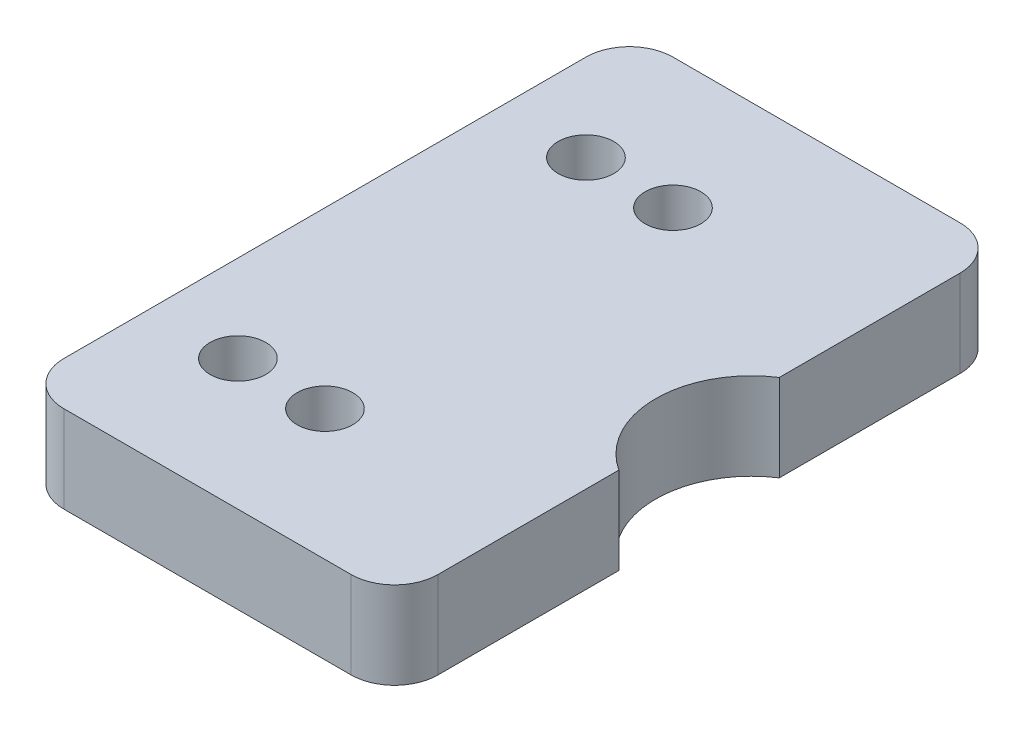
ISO-10303-21;
HEADER;
FILE_DESCRIPTION(('STEP AP214'),'2;1');
FILE_NAME('part.step','',(''),(''),'','','');
FILE_SCHEMA(('AUTOMOTIVE_DESIGN { 1 0 10303 214 1 1 1 1 }'));
ENDSEC;
DATA;
#1=APPLICATION_CONTEXT('core data for automotive mechanical design processes');
#2=APPLICATION_PROTOCOL_DEFINITION('international standard','automotive_design',2000,#1);
#3=PRODUCT_CONTEXT('',#1,'mechanical');
#4=PRODUCT('Part','Part','',(#3));
#5=PRODUCT_RELATED_PRODUCT_CATEGORY('part','',(#4));
#6=PRODUCT_DEFINITION_FORMATION('','',#4);
#7=PRODUCT_DEFINITION_CONTEXT('part definition',#1,'design');
#8=PRODUCT_DEFINITION('design','',#6,#7);
#9=PRODUCT_DEFINITION_SHAPE('','',#8);
#10=(LENGTH_UNIT() NAMED_UNIT(*) SI_UNIT(.MILLI.,.METRE.));
#11=(NAMED_UNIT(*) PLANE_ANGLE_UNIT() SI_UNIT($,.RADIAN.));
#12=(NAMED_UNIT(*) SI_UNIT($,.STERADIAN.) SOLID_ANGLE_UNIT());
#13=UNCERTAINTY_MEASURE_WITH_UNIT(LENGTH_MEASURE(1.E-05),#10,'distance_accuracy_value','');
#14=(GEOMETRIC_REPRESENTATION_CONTEXT(3) GLOBAL_UNCERTAINTY_ASSIGNED_CONTEXT((#13)) GLOBAL_UNIT_ASSIGNED_CONTEXT((#10,
#11,#12)) REPRESENTATION_CONTEXT('',''));
#15=CARTESIAN_POINT('',(0.,0.,0.));
#16=DIRECTION('',(0.,0.,1.));
#17=DIRECTION('',(1.,0.,0.));
#18=AXIS2_PLACEMENT_3D('',#15,#16,#17);
#19=CARTESIAN_POINT('',(62.23,12.7,-44.45));
#20=DIRECTION('',(0.,1.,0.));
#21=DIRECTION('',(0.,0.,1.));
#22=AXIS2_PLACEMENT_3D('',#19,#20,#21);
#23=PLANE('',#22);
#24=CARTESIAN_POINT('',(25.4,12.7,-19.05));
#25=DIRECTION('',(0.,1.,0.));
#26=DIRECTION('',(0.,0.,-1.));
#27=AXIS2_PLACEMENT_3D('',#24,#25,#26);
#28=CIRCLE('',#27,4.06399999999999);
#29=CARTESIAN_POINT('',(25.4,12.7,-23.114));
#30=VERTEX_POINT('',#29);
#31=EDGE_CURVE('E254',#30,#30,#28,.T.);
#32=ORIENTED_EDGE('',*,*,#31,.F.);
#33=EDGE_LOOP('',(#32));
#34=FACE_BOUND('',#33,.T.);
#35=CARTESIAN_POINT('',(25.4,12.7,-69.85));
#36=DIRECTION('',(0.,1.,0.));
#37=DIRECTION('',(0.,0.,1.));
#38=AXIS2_PLACEMENT_3D('',#35,#36,#37);
#39=CIRCLE('',#38,4.06399999999999);
#40=CARTESIAN_POINT('',(25.4,12.7,-65.786));
#41=VERTEX_POINT('',#40);
#42=EDGE_CURVE('E163',#41,#41,#39,.T.);
#43=ORIENTED_EDGE('',*,*,#42,.F.);
#44=EDGE_LOOP('',(#43));
#45=FACE_BOUND('',#44,.T.);
#46=DIRECTION('',(-1.,0.,0.));
#47=VECTOR('',#46,1.);
#48=CARTESIAN_POINT('',(0.,12.7,-88.9));
#49=LINE('',#48,#47);
#50=CARTESIAN_POINT('',(48.26,12.7,-88.9));
#51=VERTEX_POINT('',#50);
#52=CARTESIAN_POINT('',(6.35,12.7,-88.9));
#53=VERTEX_POINT('',#52);
#54=EDGE_CURVE('E152',#51,#53,#49,.T.);
#55=ORIENTED_EDGE('',*,*,#54,.T.);
#56=CARTESIAN_POINT('',(6.35,12.7,-82.55));
#57=DIRECTION('',(0.,1.,0.));
#58=DIRECTION('',(0.,0.,1.));
#59=AXIS2_PLACEMENT_3D('',#56,#57,#58);
#60=CIRCLE('',#59,6.35);
#61=CARTESIAN_POINT('',(0.,12.7,-82.55));
#62=VERTEX_POINT('',#61);
#63=EDGE_CURVE('E215',#53,#62,#60,.T.);
#64=ORIENTED_EDGE('',*,*,#63,.T.);
#65=DIRECTION('',(0.,0.,1.));
#66=VECTOR('',#65,1.);
#67=CARTESIAN_POINT('',(0.,12.7,0.));
#68=LINE('',#67,#66);
#69=CARTESIAN_POINT('',(0.,12.7,-6.35));
#70=VERTEX_POINT('',#69);
#71=EDGE_CURVE('E179',#62,#70,#68,.T.);
#72=ORIENTED_EDGE('',*,*,#71,.T.);
#73=CARTESIAN_POINT('',(6.35,12.7,-6.35));
#74=DIRECTION('',(0.,1.,0.));
#75=DIRECTION('',(0.,0.,1.));
#76=AXIS2_PLACEMENT_3D('',#73,#74,#75);
#77=CIRCLE('',#76,6.35);
#78=CARTESIAN_POINT('',(6.35,12.7,0.));
#79=VERTEX_POINT('',#78);
#80=EDGE_CURVE('E209',#70,#79,#77,.T.);
#81=ORIENTED_EDGE('',*,*,#80,.T.);
#82=DIRECTION('',(1.,0.,0.));
#83=VECTOR('',#82,1.);
#84=CARTESIAN_POINT('',(0.,12.7,0.));
#85=LINE('',#84,#83);
#86=CARTESIAN_POINT('',(48.26,12.7,0.));
#87=VERTEX_POINT('',#86);
#88=EDGE_CURVE('E133',#79,#87,#85,.T.);
#89=ORIENTED_EDGE('',*,*,#88,.T.);
#90=CARTESIAN_POINT('',(48.26,12.7,-6.35));
#91=DIRECTION('',(0.,1.,0.));
#92=DIRECTION('',(0.,0.,1.));
#93=AXIS2_PLACEMENT_3D('',#90,#91,#92);
#94=CIRCLE('',#93,6.35);
#95=CARTESIAN_POINT('',(54.61,12.7,-6.35));
#96=VERTEX_POINT('',#95);
#97=EDGE_CURVE('E69',#87,#96,#94,.T.);
#98=ORIENTED_EDGE('',*,*,#97,.T.);
#99=DIRECTION('',(0.,0.,-1.));
#100=VECTOR('',#99,1.);
#101=CARTESIAN_POINT('',(54.61,12.7,-32.741178539238));
#102=LINE('',#101,#100);
#103=CARTESIAN_POINT('',(54.61,12.7,-32.741178539238));
#104=VERTEX_POINT('',#103);
#105=EDGE_CURVE('E123',#96,#104,#102,.T.);
#106=ORIENTED_EDGE('',*,*,#105,.T.);
#107=CARTESIAN_POINT('',(62.23,12.7,-44.45));
#108=DIRECTION('',(0.,-1.,0.));
#109=DIRECTION('',(0.,0.,1.));
#110=AXIS2_PLACEMENT_3D('',#107,#108,#109);
#111=CIRCLE('',#110,13.97);
#112=CARTESIAN_POINT('',(54.61,12.7,-56.158821460762));
#113=VERTEX_POINT('',#112);
#114=EDGE_CURVE('E128',#104,#113,#111,.T.);
#115=ORIENTED_EDGE('',*,*,#114,.T.);
#116=DIRECTION('',(0.,0.,-1.));
#117=VECTOR('',#116,1.);
#118=CARTESIAN_POINT('',(54.61,12.7,-56.158821460762));
#119=LINE('',#118,#117);
#120=CARTESIAN_POINT('',(54.61,12.7,-82.55));
#121=VERTEX_POINT('',#120);
#122=EDGE_CURVE('E149',#113,#121,#119,.T.);
#123=ORIENTED_EDGE('',*,*,#122,.T.);
#124=CARTESIAN_POINT('',(48.26,12.7,-82.55));
#125=DIRECTION('',(0.,1.,0.));
#126=DIRECTION('',(0.,0.,1.));
#127=AXIS2_PLACEMENT_3D('',#124,#125,#126);
#128=CIRCLE('',#127,6.35);
#129=EDGE_CURVE('E212',#121,#51,#128,.T.);
#130=ORIENTED_EDGE('',*,*,#129,.T.);
#131=EDGE_LOOP('',(#55,#64,#72,#81,#89,#98,#106,#115,#123,#130));
#132=FACE_BOUND('',#131,.T.);
#133=CARTESIAN_POINT('',(12.7,12.7,-69.85));
#134=DIRECTION('',(0.,1.,0.));
#135=DIRECTION('',(0.,0.,1.));
#136=AXIS2_PLACEMENT_3D('',#133,#134,#135);
#137=CIRCLE('',#136,4.06399999999999);
#138=CARTESIAN_POINT('',(12.7,12.7,-65.786));
#139=VERTEX_POINT('',#138);
#140=EDGE_CURVE('E246',#139,#139,#137,.T.);
#141=ORIENTED_EDGE('',*,*,#140,.F.);
#142=EDGE_LOOP('',(#141));
#143=FACE_BOUND('',#142,.T.);
#144=CARTESIAN_POINT('',(12.7,12.7,-19.05));
#145=DIRECTION('',(0.,1.,0.));
#146=DIRECTION('',(0.,0.,-1.));
#147=AXIS2_PLACEMENT_3D('',#144,#145,#146);
#148=CIRCLE('',#147,4.06399999999999);
#149=CARTESIAN_POINT('',(12.7,12.7,-23.114));
#150=VERTEX_POINT('',#149);
#151=EDGE_CURVE('E262',#150,#150,#148,.T.);
#152=ORIENTED_EDGE('',*,*,#151,.F.);
#153=EDGE_LOOP('',(#152));
#154=FACE_BOUND('',#153,.T.);
#155=ADVANCED_FACE('F45',(#34,#45,#132,#143,#154),#23,.T.);
#156=CARTESIAN_POINT('',(62.23,0.,-44.45));
#157=DIRECTION('',(0.,1.,0.));
#158=DIRECTION('',(0.,0.,1.));
#159=AXIS2_PLACEMENT_3D('',#156,#157,#158);
#160=PLANE('',#159);
#161=DIRECTION('',(0.,0.,1.));
#162=VECTOR('',#161,1.);
#163=CARTESIAN_POINT('',(0.,0.,0.));
#164=LINE('',#163,#162);
#165=CARTESIAN_POINT('',(0.,0.,-82.55));
#166=VERTEX_POINT('',#165);
#167=CARTESIAN_POINT('',(0.,0.,-6.35));
#168=VERTEX_POINT('',#167);
#169=EDGE_CURVE('E158',#166,#168,#164,.T.);
#170=ORIENTED_EDGE('',*,*,#169,.F.);
#171=CARTESIAN_POINT('',(6.35,0.,-82.55));
#172=DIRECTION('',(0.,1.,0.));
#173=DIRECTION('',(0.,0.,1.));
#174=AXIS2_PLACEMENT_3D('',#171,#172,#173);
#175=CIRCLE('',#174,6.35);
#176=CARTESIAN_POINT('',(6.35,0.,-88.9));
#177=VERTEX_POINT('',#176);
#178=EDGE_CURVE('E197',#166,#177,#175,.F.);
#179=ORIENTED_EDGE('',*,*,#178,.T.);
#180=DIRECTION('',(-1.,0.,0.));
#181=VECTOR('',#180,1.);
#182=CARTESIAN_POINT('',(0.,0.,-88.9));
#183=LINE('',#182,#181);
#184=CARTESIAN_POINT('',(48.26,0.,-88.9));
#185=VERTEX_POINT('',#184);
#186=EDGE_CURVE('E175',#185,#177,#183,.T.);
#187=ORIENTED_EDGE('',*,*,#186,.F.);
#188=CARTESIAN_POINT('',(48.26,0.,-82.55));
#189=DIRECTION('',(0.,1.,0.));
#190=DIRECTION('',(0.,0.,1.));
#191=AXIS2_PLACEMENT_3D('',#188,#189,#190);
#192=CIRCLE('',#191,6.35);
#193=CARTESIAN_POINT('',(54.61,0.,-82.55));
#194=VERTEX_POINT('',#193);
#195=EDGE_CURVE('E194',#185,#194,#192,.F.);
#196=ORIENTED_EDGE('',*,*,#195,.T.);
#197=DIRECTION('',(0.,0.,-1.));
#198=VECTOR('',#197,1.);
#199=CARTESIAN_POINT('',(54.61,0.,-56.158821460762));
#200=LINE('',#199,#198);
#201=CARTESIAN_POINT('',(54.61,0.,-56.158821460762));
#202=VERTEX_POINT('',#201);
#203=EDGE_CURVE('E172',#202,#194,#200,.T.);
#204=ORIENTED_EDGE('',*,*,#203,.F.);
#205=CARTESIAN_POINT('',(62.23,0.,-44.45));
#206=DIRECTION('',(0.,-1.,0.));
#207=DIRECTION('',(0.,0.,1.));
#208=AXIS2_PLACEMENT_3D('',#205,#206,#207);
#209=CIRCLE('',#208,13.97);
#210=CARTESIAN_POINT('',(54.61,0.,-32.741178539238));
#211=VERTEX_POINT('',#210);
#212=EDGE_CURVE('E169',#211,#202,#209,.T.);
#213=ORIENTED_EDGE('',*,*,#212,.F.);
#214=DIRECTION('',(0.,0.,-1.));
#215=VECTOR('',#214,1.);
#216=CARTESIAN_POINT('',(54.61,0.,-32.741178539238));
#217=LINE('',#216,#215);
#218=CARTESIAN_POINT('',(54.61,0.,-6.35));
#219=VERTEX_POINT('',#218);
#220=EDGE_CURVE('E139',#219,#211,#217,.T.);
#221=ORIENTED_EDGE('',*,*,#220,.F.);
#222=CARTESIAN_POINT('',(48.26,0.,-6.35));
#223=DIRECTION('',(0.,1.,0.));
#224=DIRECTION('',(0.,0.,1.));
#225=AXIS2_PLACEMENT_3D('',#222,#223,#224);
#226=CIRCLE('',#225,6.35);
#227=CARTESIAN_POINT('',(48.26,0.,0.));
#228=VERTEX_POINT('',#227);
#229=EDGE_CURVE('E188',#219,#228,#226,.F.);
#230=ORIENTED_EDGE('',*,*,#229,.T.);
#231=DIRECTION('',(1.,0.,0.));
#232=VECTOR('',#231,1.);
#233=CARTESIAN_POINT('',(0.,0.,0.));
#234=LINE('',#233,#232);
#235=CARTESIAN_POINT('',(6.35,0.,0.));
#236=VERTEX_POINT('',#235);
#237=EDGE_CURVE('E162',#236,#228,#234,.T.);
#238=ORIENTED_EDGE('',*,*,#237,.F.);
#239=CARTESIAN_POINT('',(6.35,0.,-6.35));
#240=DIRECTION('',(0.,1.,0.));
#241=DIRECTION('',(0.,0.,1.));
#242=AXIS2_PLACEMENT_3D('',#239,#240,#241);
#243=CIRCLE('',#242,6.35);
#244=EDGE_CURVE('E191',#236,#168,#243,.F.);
#245=ORIENTED_EDGE('',*,*,#244,.T.);
#246=EDGE_LOOP('',(#170,#179,#187,#196,#204,#213,#221,#230,#238,#245));
#247=FACE_BOUND('',#246,.T.);
#248=CARTESIAN_POINT('',(25.4,0.,-69.85));
#249=DIRECTION('',(0.,1.,0.));
#250=DIRECTION('',(0.,0.,1.));
#251=AXIS2_PLACEMENT_3D('',#248,#249,#250);
#252=CIRCLE('',#251,4.06399999999999);
#253=CARTESIAN_POINT('',(25.4,0.,-65.786));
#254=VERTEX_POINT('',#253);
#255=EDGE_CURVE('E242',#254,#254,#252,.T.);
#256=ORIENTED_EDGE('',*,*,#255,.T.);
#257=EDGE_LOOP('',(#256));
#258=FACE_BOUND('',#257,.T.);
#259=CARTESIAN_POINT('',(12.7,0.,-69.85));
#260=DIRECTION('',(0.,1.,0.));
#261=DIRECTION('',(0.,0.,1.));
#262=AXIS2_PLACEMENT_3D('',#259,#260,#261);
#263=CIRCLE('',#262,4.06399999999999);
#264=CARTESIAN_POINT('',(12.7,0.,-65.786));
#265=VERTEX_POINT('',#264);
#266=EDGE_CURVE('E250',#265,#265,#263,.T.);
#267=ORIENTED_EDGE('',*,*,#266,.T.);
#268=EDGE_LOOP('',(#267));
#269=FACE_BOUND('',#268,.T.);
#270=CARTESIAN_POINT('',(25.4,0.,-19.05));
#271=DIRECTION('',(0.,1.,0.));
#272=DIRECTION('',(0.,0.,-1.));
#273=AXIS2_PLACEMENT_3D('',#270,#271,#272);
#274=CIRCLE('',#273,4.06399999999999);
#275=CARTESIAN_POINT('',(25.4,0.,-23.114));
#276=VERTEX_POINT('',#275);
#277=EDGE_CURVE('E258',#276,#276,#274,.T.);
#278=ORIENTED_EDGE('',*,*,#277,.T.);
#279=EDGE_LOOP('',(#278));
#280=FACE_BOUND('',#279,.T.);
#281=CARTESIAN_POINT('',(12.7,0.,-19.05));
#282=DIRECTION('',(0.,1.,0.));
#283=DIRECTION('',(0.,0.,-1.));
#284=AXIS2_PLACEMENT_3D('',#281,#282,#283);
#285=CIRCLE('',#284,4.06399999999999);
#286=CARTESIAN_POINT('',(12.7,0.,-23.114));
#287=VERTEX_POINT('',#286);
#288=EDGE_CURVE('E266',#287,#287,#285,.T.);
#289=ORIENTED_EDGE('',*,*,#288,.T.);
#290=EDGE_LOOP('',(#289));
#291=FACE_BOUND('',#290,.T.);
#292=ADVANCED_FACE('F234',(#247,#258,#269,#280,#291),#160,.F.);
#293=CARTESIAN_POINT('',(0.,12.7,0.));
#294=DIRECTION('',(1.,0.,0.));
#295=DIRECTION('',(0.,0.,-1.));
#296=AXIS2_PLACEMENT_3D('',#293,#294,#295);
#297=PLANE('',#296);
#298=ORIENTED_EDGE('',*,*,#71,.F.);
#299=DIRECTION('',(0.,-1.,0.));
#300=VECTOR('',#299,1.);
#301=CARTESIAN_POINT('',(0.,12.7,-82.55));
#302=LINE('',#301,#300);
#303=EDGE_CURVE('E184',#62,#166,#302,.T.);
#304=ORIENTED_EDGE('',*,*,#303,.T.);
#305=ORIENTED_EDGE('',*,*,#169,.T.);
#306=DIRECTION('',(0.,-1.,0.));
#307=VECTOR('',#306,1.);
#308=CARTESIAN_POINT('',(0.,12.7,-6.35));
#309=LINE('',#308,#307);
#310=EDGE_CURVE('E143',#168,#70,#309,.F.);
#311=ORIENTED_EDGE('',*,*,#310,.T.);
#312=EDGE_LOOP('',(#298,#304,#305,#311));
#313=FACE_BOUND('',#312,.T.);
#314=ADVANCED_FACE('F284',(#313),#297,.F.);
#315=CARTESIAN_POINT('',(0.,12.7,0.));
#316=DIRECTION('',(0.,0.,-1.));
#317=DIRECTION('',(-1.,0.,0.));
#318=AXIS2_PLACEMENT_3D('',#315,#316,#317);
#319=PLANE('',#318);
#320=ORIENTED_EDGE('',*,*,#88,.F.);
#321=DIRECTION('',(0.,-1.,0.));
#322=VECTOR('',#321,1.);
#323=CARTESIAN_POINT('',(6.35,12.7,0.));
#324=LINE('',#323,#322);
#325=EDGE_CURVE('E54',#79,#236,#324,.T.);
#326=ORIENTED_EDGE('',*,*,#325,.T.);
#327=ORIENTED_EDGE('',*,*,#237,.T.);
#328=DIRECTION('',(0.,-1.,0.));
#329=VECTOR('',#328,1.);
#330=CARTESIAN_POINT('',(48.26,12.7,0.));
#331=LINE('',#330,#329);
#332=EDGE_CURVE('E220',#228,#87,#331,.F.);
#333=ORIENTED_EDGE('',*,*,#332,.T.);
#334=EDGE_LOOP('',(#320,#326,#327,#333));
#335=FACE_BOUND('',#334,.T.);
#336=ADVANCED_FACE('F228',(#335),#319,.F.);
#337=CARTESIAN_POINT('',(54.61,12.7,-32.741178539238));
#338=DIRECTION('',(-1.,0.,0.));
#339=DIRECTION('',(0.,0.,1.));
#340=AXIS2_PLACEMENT_3D('',#337,#338,#339);
#341=PLANE('',#340);
#342=ORIENTED_EDGE('',*,*,#105,.F.);
#343=DIRECTION('',(0.,-1.,0.));
#344=VECTOR('',#343,1.);
#345=CARTESIAN_POINT('',(54.61,12.7,-6.35));
#346=LINE('',#345,#344);
#347=EDGE_CURVE('E11',#96,#219,#346,.T.);
#348=ORIENTED_EDGE('',*,*,#347,.T.);
#349=ORIENTED_EDGE('',*,*,#220,.T.);
#350=DIRECTION('',(0.,-1.,0.));
#351=VECTOR('',#350,1.);
#352=CARTESIAN_POINT('',(54.61,12.7,-32.741178539238));
#353=LINE('',#352,#351);
#354=EDGE_CURVE('E136',#104,#211,#353,.T.);
#355=ORIENTED_EDGE('',*,*,#354,.F.);
#356=EDGE_LOOP('',(#342,#348,#349,#355));
#357=FACE_BOUND('',#356,.T.);
#358=ADVANCED_FACE('F137',(#357),#341,.F.);
#359=CARTESIAN_POINT('',(62.23,12.7,-44.45));
#360=DIRECTION('',(0.,-1.,0.));
#361=DIRECTION('',(0.,0.,-1.));
#362=AXIS2_PLACEMENT_3D('',#359,#360,#361);
#363=CYLINDRICAL_SURFACE('',#362,13.97);
#364=ORIENTED_EDGE('',*,*,#212,.T.);
#365=DIRECTION('',(0.,-1.,0.));
#366=VECTOR('',#365,1.);
#367=CARTESIAN_POINT('',(54.61,12.7,-56.158821460762));
#368=LINE('',#367,#366);
#369=EDGE_CURVE('E144',#113,#202,#368,.T.);
#370=ORIENTED_EDGE('',*,*,#369,.F.);
#371=ORIENTED_EDGE('',*,*,#114,.F.);
#372=ORIENTED_EDGE('',*,*,#354,.T.);
#373=EDGE_LOOP('',(#364,#370,#371,#372));
#374=FACE_BOUND('',#373,.T.);
#375=ADVANCED_FACE('F146',(#374),#363,.F.);
#376=CARTESIAN_POINT('',(54.61,12.7,-56.158821460762));
#377=DIRECTION('',(-1.,0.,0.));
#378=DIRECTION('',(0.,0.,1.));
#379=AXIS2_PLACEMENT_3D('',#376,#377,#378);
#380=PLANE('',#379);
#381=ORIENTED_EDGE('',*,*,#203,.T.);
#382=DIRECTION('',(0.,-1.,0.));
#383=VECTOR('',#382,1.);
#384=CARTESIAN_POINT('',(54.61,12.7,-82.55));
#385=LINE('',#384,#383);
#386=EDGE_CURVE('E61',#194,#121,#385,.F.);
#387=ORIENTED_EDGE('',*,*,#386,.T.);
#388=ORIENTED_EDGE('',*,*,#122,.F.);
#389=ORIENTED_EDGE('',*,*,#369,.T.);
#390=EDGE_LOOP('',(#381,#387,#388,#389));
#391=FACE_BOUND('',#390,.T.);
#392=ADVANCED_FACE('F295',(#391),#380,.F.);
#393=CARTESIAN_POINT('',(0.,12.7,-88.9));
#394=DIRECTION('',(0.,0.,1.));
#395=DIRECTION('',(1.,0.,0.));
#396=AXIS2_PLACEMENT_3D('',#393,#394,#395);
#397=PLANE('',#396);
#398=ORIENTED_EDGE('',*,*,#186,.T.);
#399=DIRECTION('',(0.,-1.,0.));
#400=VECTOR('',#399,1.);
#401=CARTESIAN_POINT('',(6.35,12.7,-88.9));
#402=LINE('',#401,#400);
#403=EDGE_CURVE('E204',#177,#53,#402,.F.);
#404=ORIENTED_EDGE('',*,*,#403,.T.);
#405=ORIENTED_EDGE('',*,*,#54,.F.);
#406=DIRECTION('',(0.,-1.,0.));
#407=VECTOR('',#406,1.);
#408=CARTESIAN_POINT('',(48.26,12.7,-88.9));
#409=LINE('',#408,#407);
#410=EDGE_CURVE('E200',#51,#185,#409,.T.);
#411=ORIENTED_EDGE('',*,*,#410,.T.);
#412=EDGE_LOOP('',(#398,#404,#405,#411));
#413=FACE_BOUND('',#412,.T.);
#414=ADVANCED_FACE('F292',(#413),#397,.F.);
#415=CARTESIAN_POINT('',(25.4,12.7,-69.85));
#416=DIRECTION('',(0.,-1.,0.));
#417=DIRECTION('',(0.,0.,-1.));
#418=AXIS2_PLACEMENT_3D('',#415,#416,#417);
#419=CYLINDRICAL_SURFACE('',#418,4.06399999999999);
#420=ORIENTED_EDGE('',*,*,#42,.T.);
#421=EDGE_LOOP('',(#420));
#422=FACE_BOUND('',#421,.T.);
#423=ORIENTED_EDGE('',*,*,#255,.F.);
#424=EDGE_LOOP('',(#423));
#425=FACE_BOUND('',#424,.T.);
#426=ADVANCED_FACE('F289',(#422,#425),#419,.F.);
#427=CARTESIAN_POINT('',(12.7,12.7,-69.85));
#428=DIRECTION('',(0.,-1.,0.));
#429=DIRECTION('',(0.,0.,-1.));
#430=AXIS2_PLACEMENT_3D('',#427,#428,#429);
#431=CYLINDRICAL_SURFACE('',#430,4.06399999999999);
#432=ORIENTED_EDGE('',*,*,#140,.T.);
#433=EDGE_LOOP('',(#432));
#434=FACE_BOUND('',#433,.T.);
#435=ORIENTED_EDGE('',*,*,#266,.F.);
#436=EDGE_LOOP('',(#435));
#437=FACE_BOUND('',#436,.T.);
#438=ADVANCED_FACE('F366',(#434,#437),#431,.F.);
#439=CARTESIAN_POINT('',(25.4,12.7,-19.05));
#440=DIRECTION('',(0.,-1.,0.));
#441=DIRECTION('',(0.,0.,-1.));
#442=AXIS2_PLACEMENT_3D('',#439,#440,#441);
#443=CYLINDRICAL_SURFACE('',#442,4.06399999999999);
#444=ORIENTED_EDGE('',*,*,#31,.T.);
#445=EDGE_LOOP('',(#444));
#446=FACE_BOUND('',#445,.T.);
#447=ORIENTED_EDGE('',*,*,#277,.F.);
#448=EDGE_LOOP('',(#447));
#449=FACE_BOUND('',#448,.T.);
#450=ADVANCED_FACE('F357',(#446,#449),#443,.F.);
#451=CARTESIAN_POINT('',(12.7,12.7,-19.05));
#452=DIRECTION('',(0.,-1.,0.));
#453=DIRECTION('',(0.,0.,-1.));
#454=AXIS2_PLACEMENT_3D('',#451,#452,#453);
#455=CYLINDRICAL_SURFACE('',#454,4.06399999999999);
#456=ORIENTED_EDGE('',*,*,#151,.T.);
#457=EDGE_LOOP('',(#456));
#458=FACE_BOUND('',#457,.T.);
#459=ORIENTED_EDGE('',*,*,#288,.F.);
#460=EDGE_LOOP('',(#459));
#461=FACE_BOUND('',#460,.T.);
#462=ADVANCED_FACE('F274',(#458,#461),#455,.F.);
#463=CARTESIAN_POINT('',(6.35,12.7,-82.55));
#464=DIRECTION('',(0.,-1.,0.));
#465=DIRECTION('',(0.,0.,-1.));
#466=AXIS2_PLACEMENT_3D('',#463,#464,#465);
#467=CYLINDRICAL_SURFACE('',#466,6.35);
#468=ORIENTED_EDGE('',*,*,#63,.F.);
#469=ORIENTED_EDGE('',*,*,#403,.F.);
#470=ORIENTED_EDGE('',*,*,#178,.F.);
#471=ORIENTED_EDGE('',*,*,#303,.F.);
#472=EDGE_LOOP('',(#468,#469,#470,#471));
#473=FACE_BOUND('',#472,.T.);
#474=ADVANCED_FACE('F308',(#473),#467,.T.);
#475=CARTESIAN_POINT('',(48.26,12.7,-82.55));
#476=DIRECTION('',(0.,-1.,0.));
#477=DIRECTION('',(0.,0.,-1.));
#478=AXIS2_PLACEMENT_3D('',#475,#476,#477);
#479=CYLINDRICAL_SURFACE('',#478,6.35);
#480=ORIENTED_EDGE('',*,*,#129,.F.);
#481=ORIENTED_EDGE('',*,*,#386,.F.);
#482=ORIENTED_EDGE('',*,*,#195,.F.);
#483=ORIENTED_EDGE('',*,*,#410,.F.);
#484=EDGE_LOOP('',(#480,#481,#482,#483));
#485=FACE_BOUND('',#484,.T.);
#486=ADVANCED_FACE('F311',(#485),#479,.T.);
#487=CARTESIAN_POINT('',(6.35,12.7,-6.35));
#488=DIRECTION('',(0.,-1.,0.));
#489=DIRECTION('',(0.,0.,-1.));
#490=AXIS2_PLACEMENT_3D('',#487,#488,#489);
#491=CYLINDRICAL_SURFACE('',#490,6.35);
#492=ORIENTED_EDGE('',*,*,#80,.F.);
#493=ORIENTED_EDGE('',*,*,#310,.F.);
#494=ORIENTED_EDGE('',*,*,#244,.F.);
#495=ORIENTED_EDGE('',*,*,#325,.F.);
#496=EDGE_LOOP('',(#492,#493,#494,#495));
#497=FACE_BOUND('',#496,.T.);
#498=ADVANCED_FACE('F314',(#497),#491,.T.);
#499=CARTESIAN_POINT('',(48.26,12.7,-6.35));
#500=DIRECTION('',(0.,-1.,0.));
#501=DIRECTION('',(0.,0.,-1.));
#502=AXIS2_PLACEMENT_3D('',#499,#500,#501);
#503=CYLINDRICAL_SURFACE('',#502,6.35);
#504=ORIENTED_EDGE('',*,*,#97,.F.);
#505=ORIENTED_EDGE('',*,*,#332,.F.);
#506=ORIENTED_EDGE('',*,*,#229,.F.);
#507=ORIENTED_EDGE('',*,*,#347,.F.);
#508=EDGE_LOOP('',(#504,#505,#506,#507));
#509=FACE_BOUND('',#508,.T.);
#510=ADVANCED_FACE('F47',(#509),#503,.T.);
#511=CLOSED_SHELL('',(#155,#292,#314,#336,#358,#375,#392,#414,#426,#438,#450,#462,#474,#486,
#498,#510));
#512=MANIFOLD_SOLID_BREP('B2',#511);
#513=ADVANCED_BREP_SHAPE_REPRESENTATION('',(#18,#512),#14);
#514=SHAPE_DEFINITION_REPRESENTATION(#9,#513);
ENDSEC;
END-ISO-10303-21;
